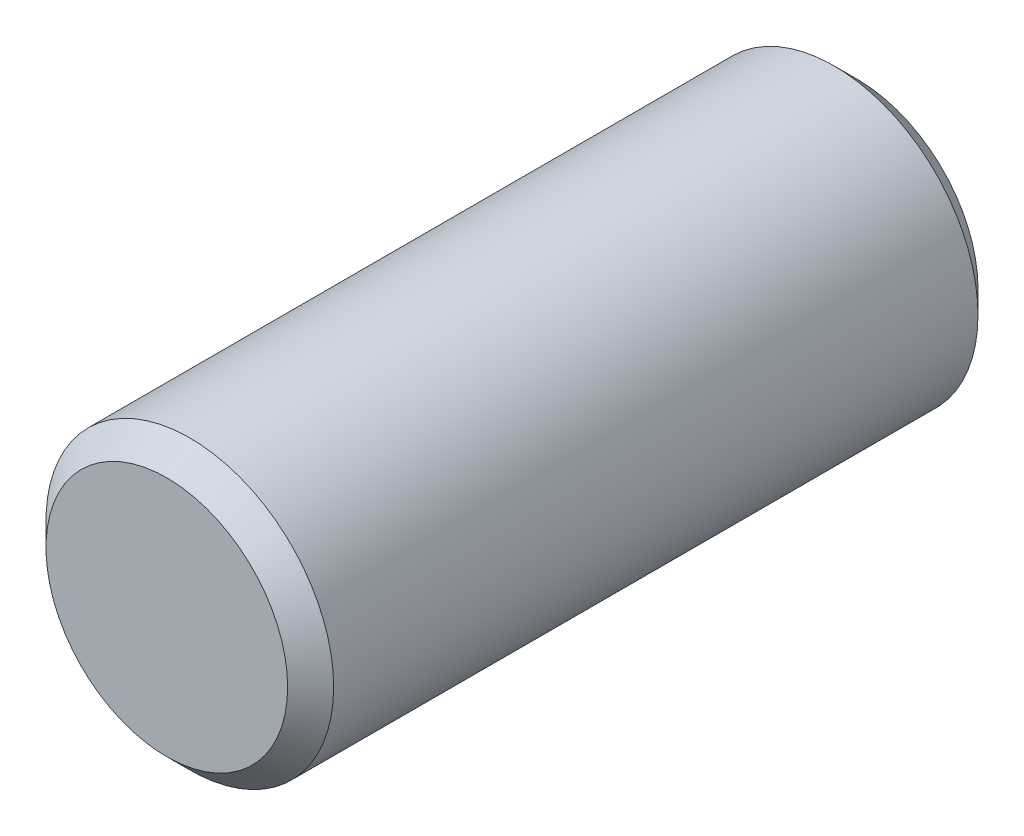
ISO-10303-21;
HEADER;
FILE_DESCRIPTION(('STEP AP214'),'2;1');
FILE_NAME('part.step','',(''),(''),'','','');
FILE_SCHEMA(('AUTOMOTIVE_DESIGN { 1 0 10303 214 1 1 1 1 }'));
ENDSEC;
DATA;
#1=APPLICATION_CONTEXT('core data for automotive mechanical design processes');
#2=APPLICATION_PROTOCOL_DEFINITION('international standard','automotive_design',2000,#1);
#3=PRODUCT_CONTEXT('',#1,'mechanical');
#4=PRODUCT('Part','Part','',(#3));
#5=PRODUCT_RELATED_PRODUCT_CATEGORY('part','',(#4));
#6=PRODUCT_DEFINITION_FORMATION('','',#4);
#7=PRODUCT_DEFINITION_CONTEXT('part definition',#1,'design');
#8=PRODUCT_DEFINITION('design','',#6,#7);
#9=PRODUCT_DEFINITION_SHAPE('','',#8);
#10=(LENGTH_UNIT() NAMED_UNIT(*) SI_UNIT(.MILLI.,.METRE.));
#11=(NAMED_UNIT(*) PLANE_ANGLE_UNIT() SI_UNIT($,.RADIAN.));
#12=(NAMED_UNIT(*) SI_UNIT($,.STERADIAN.) SOLID_ANGLE_UNIT());
#13=UNCERTAINTY_MEASURE_WITH_UNIT(LENGTH_MEASURE(1.E-05),#10,'distance_accuracy_value','');
#14=(GEOMETRIC_REPRESENTATION_CONTEXT(3) GLOBAL_UNCERTAINTY_ASSIGNED_CONTEXT((#13)) GLOBAL_UNIT_ASSIGNED_CONTEXT((#10,
#11,#12)) REPRESENTATION_CONTEXT('',''));
#15=CARTESIAN_POINT('',(0.,0.,0.));
#16=DIRECTION('',(0.,0.,1.));
#17=DIRECTION('',(1.,0.,0.));
#18=AXIS2_PLACEMENT_3D('',#15,#16,#17);
#19=CARTESIAN_POINT('',(0.,0.,6.));
#20=DIRECTION('',(0.,0.,-1.));
#21=DIRECTION('',(-1.,0.,0.));
#22=AXIS2_PLACEMENT_3D('',#19,#20,#21);
#23=CYLINDRICAL_SURFACE('',#22,1.25);
#24=CARTESIAN_POINT('',(0.,0.,5.8));
#25=DIRECTION('',(0.,0.,1.));
#26=DIRECTION('',(1.,0.,0.));
#27=AXIS2_PLACEMENT_3D('',#24,#25,#26);
#28=CIRCLE('',#27,1.25);
#29=CARTESIAN_POINT('',(1.25,0.,5.8));
#30=VERTEX_POINT('',#29);
#31=EDGE_CURVE('E39',#30,#30,#28,.F.);
#32=ORIENTED_EDGE('',*,*,#31,.T.);
#33=EDGE_LOOP('',(#32));
#34=FACE_BOUND('',#33,.T.);
#35=CARTESIAN_POINT('',(0.,0.,0.200000000000001));
#36=DIRECTION('',(0.,0.,1.));
#37=DIRECTION('',(1.,0.,0.));
#38=AXIS2_PLACEMENT_3D('',#35,#36,#37);
#39=CIRCLE('',#38,1.25);
#40=CARTESIAN_POINT('',(1.25,0.,0.200000000000001));
#41=VERTEX_POINT('',#40);
#42=EDGE_CURVE('E43',#41,#41,#39,.T.);
#43=ORIENTED_EDGE('',*,*,#42,.T.);
#44=EDGE_LOOP('',(#43));
#45=FACE_BOUND('',#44,.T.);
#46=ADVANCED_FACE('F32',(#34,#45),#23,.T.);
#47=CARTESIAN_POINT('',(0.,0.,6.));
#48=DIRECTION('',(0.,0.,1.));
#49=DIRECTION('',(1.,0.,0.));
#50=AXIS2_PLACEMENT_3D('',#47,#48,#49);
#51=PLANE('',#50);
#52=CARTESIAN_POINT('',(0.,0.,6.));
#53=DIRECTION('',(0.,0.,1.));
#54=DIRECTION('',(1.,0.,0.));
#55=AXIS2_PLACEMENT_3D('',#52,#53,#54);
#56=CIRCLE('',#55,1.05);
#57=CARTESIAN_POINT('',(1.05,0.,6.));
#58=VERTEX_POINT('',#57);
#59=EDGE_CURVE('E47',#58,#58,#56,.T.);
#60=ORIENTED_EDGE('',*,*,#59,.T.);
#61=EDGE_LOOP('',(#60));
#62=FACE_BOUND('',#61,.T.);
#63=ADVANCED_FACE('F53',(#62),#51,.T.);
#64=CARTESIAN_POINT('',(0.,0.,0.));
#65=DIRECTION('',(0.,0.,1.));
#66=DIRECTION('',(1.,0.,0.));
#67=AXIS2_PLACEMENT_3D('',#64,#65,#66);
#68=PLANE('',#67);
#69=CARTESIAN_POINT('',(0.,0.,0.));
#70=DIRECTION('',(0.,0.,1.));
#71=DIRECTION('',(1.,0.,0.));
#72=AXIS2_PLACEMENT_3D('',#69,#70,#71);
#73=CIRCLE('',#72,1.05);
#74=CARTESIAN_POINT('',(1.05,0.,0.));
#75=VERTEX_POINT('',#74);
#76=EDGE_CURVE('E10',#75,#75,#73,.F.);
#77=ORIENTED_EDGE('',*,*,#76,.T.);
#78=EDGE_LOOP('',(#77));
#79=FACE_BOUND('',#78,.T.);
#80=ADVANCED_FACE('F57',(#79),#68,.F.);
#81=CARTESIAN_POINT('',(0.,0.,6.));
#82=DIRECTION('',(0.,0.,-1.));
#83=DIRECTION('',(-1.,0.,0.));
#84=AXIS2_PLACEMENT_3D('',#81,#82,#83);
#85=CONICAL_SURFACE('',#84,1.05,0.785398163397446);
#86=ORIENTED_EDGE('',*,*,#31,.F.);
#87=EDGE_LOOP('',(#86));
#88=FACE_BOUND('',#87,.T.);
#89=ORIENTED_EDGE('',*,*,#59,.F.);
#90=EDGE_LOOP('',(#89));
#91=FACE_BOUND('',#90,.T.);
#92=ADVANCED_FACE('F55',(#88,#91),#85,.T.);
#93=CARTESIAN_POINT('',(0.,0.,0.200000000000001));
#94=DIRECTION('',(0.,0.,1.));
#95=DIRECTION('',(1.,0.,0.));
#96=AXIS2_PLACEMENT_3D('',#93,#94,#95);
#97=CONICAL_SURFACE('',#96,1.25,0.785398163397449);
#98=ORIENTED_EDGE('',*,*,#76,.F.);
#99=EDGE_LOOP('',(#98));
#100=FACE_BOUND('',#99,.T.);
#101=ORIENTED_EDGE('',*,*,#42,.F.);
#102=EDGE_LOOP('',(#101));
#103=FACE_BOUND('',#102,.T.);
#104=ADVANCED_FACE('F34',(#100,#103),#97,.T.);
#105=CLOSED_SHELL('',(#46,#63,#80,#92,#104));
#106=MANIFOLD_SOLID_BREP('B2',#105);
#107=ADVANCED_BREP_SHAPE_REPRESENTATION('',(#18,#106),#14);
#108=SHAPE_DEFINITION_REPRESENTATION(#9,#107);
ENDSEC;
END-ISO-10303-21;
